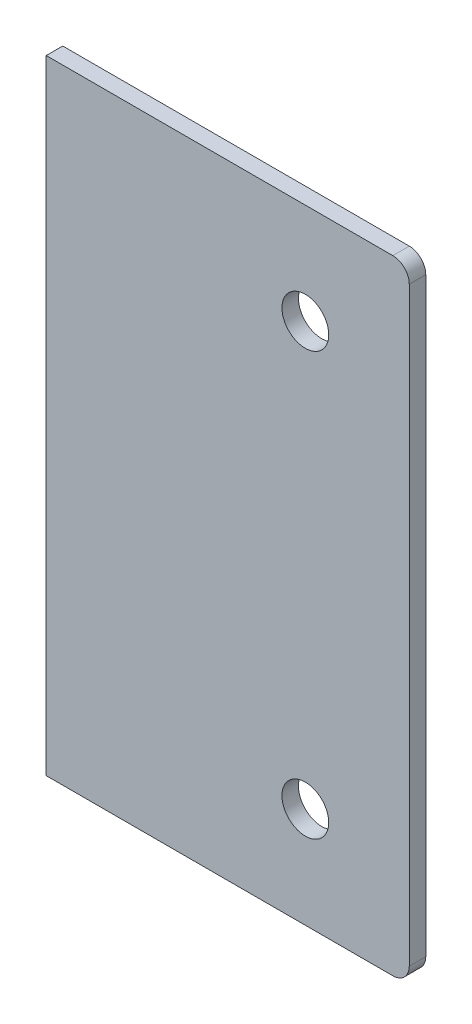
ISO-10303-21;
HEADER;
FILE_DESCRIPTION(('STEP AP214'),'2;1');
FILE_NAME('part.step','',(''),(''),'','','');
FILE_SCHEMA(('AUTOMOTIVE_DESIGN { 1 0 10303 214 1 1 1 1 }'));
ENDSEC;
DATA;
#1=APPLICATION_CONTEXT('core data for automotive mechanical design processes');
#2=APPLICATION_PROTOCOL_DEFINITION('international standard','automotive_design',2000,#1);
#3=PRODUCT_CONTEXT('',#1,'mechanical');
#4=PRODUCT('Part','Part','',(#3));
#5=PRODUCT_RELATED_PRODUCT_CATEGORY('part','',(#4));
#6=PRODUCT_DEFINITION_FORMATION('','',#4);
#7=PRODUCT_DEFINITION_CONTEXT('part definition',#1,'design');
#8=PRODUCT_DEFINITION('design','',#6,#7);
#9=PRODUCT_DEFINITION_SHAPE('','',#8);
#10=(LENGTH_UNIT() NAMED_UNIT(*) SI_UNIT(.MILLI.,.METRE.));
#11=(NAMED_UNIT(*) PLANE_ANGLE_UNIT() SI_UNIT($,.RADIAN.));
#12=(NAMED_UNIT(*) SI_UNIT($,.STERADIAN.) SOLID_ANGLE_UNIT());
#13=UNCERTAINTY_MEASURE_WITH_UNIT(LENGTH_MEASURE(1.E-05),#10,'distance_accuracy_value','');
#14=(GEOMETRIC_REPRESENTATION_CONTEXT(3) GLOBAL_UNCERTAINTY_ASSIGNED_CONTEXT((#13)) GLOBAL_UNIT_ASSIGNED_CONTEXT((#10,
#11,#12)) REPRESENTATION_CONTEXT('',''));
#15=CARTESIAN_POINT('',(0.,0.,0.));
#16=DIRECTION('',(0.,0.,1.));
#17=DIRECTION('',(1.,0.,0.));
#18=AXIS2_PLACEMENT_3D('',#15,#16,#17);
#19=CARTESIAN_POINT('',(9.38591339317018,73.2740420144,-1.5875));
#20=DIRECTION('',(1.,0.,0.));
#21=DIRECTION('',(0.,1.,0.));
#22=AXIS2_PLACEMENT_3D('',#19,#20,#21);
#23=PLANE('',#22);
#24=DIRECTION('',(0.,1.,0.));
#25=VECTOR('',#24,1.);
#26=CARTESIAN_POINT('',(9.38591339317018,73.2740420144,0.));
#27=LINE('',#26,#25);
#28=CARTESIAN_POINT('',(9.38591339317019,14.8615420144,0.));
#29=VERTEX_POINT('',#28);
#30=CARTESIAN_POINT('',(9.38591339317018,71.6865420143999,0.));
#31=VERTEX_POINT('',#30);
#32=EDGE_CURVE('E112',#29,#31,#27,.T.);
#33=ORIENTED_EDGE('',*,*,#32,.F.);
#34=DIRECTION('',(0.,0.,1.));
#35=VECTOR('',#34,1.);
#36=CARTESIAN_POINT('',(9.38591339317019,14.8615420144,-1.5875));
#37=LINE('',#36,#35);
#38=CARTESIAN_POINT('',(9.38591339317019,14.8615420144,-1.5875));
#39=VERTEX_POINT('',#38);
#40=EDGE_CURVE('E133',#29,#39,#37,.F.);
#41=ORIENTED_EDGE('',*,*,#40,.T.);
#42=DIRECTION('',(0.,1.,0.));
#43=VECTOR('',#42,1.);
#44=CARTESIAN_POINT('',(9.38591339317018,73.2740420144,-1.5875));
#45=LINE('',#44,#43);
#46=CARTESIAN_POINT('',(9.38591339317018,71.6865420143999,-1.5875));
#47=VERTEX_POINT('',#46);
#48=EDGE_CURVE('E95',#39,#47,#45,.T.);
#49=ORIENTED_EDGE('',*,*,#48,.T.);
#50=DIRECTION('',(0.,0.,1.));
#51=VECTOR('',#50,1.);
#52=CARTESIAN_POINT('',(9.38591339317018,71.6865420143999,-1.5875));
#53=LINE('',#52,#51);
#54=EDGE_CURVE('E130',#47,#31,#53,.T.);
#55=ORIENTED_EDGE('',*,*,#54,.T.);
#56=EDGE_LOOP('',(#33,#41,#49,#55));
#57=FACE_BOUND('',#56,.T.);
#58=ADVANCED_FACE('F37',(#57),#23,.T.);
#59=CARTESIAN_POINT('',(9.38591339317019,13.2740420144,-1.5875));
#60=DIRECTION('',(0.,-1.,0.));
#61=DIRECTION('',(1.,0.,0.));
#62=AXIS2_PLACEMENT_3D('',#59,#60,#61);
#63=PLANE('',#62);
#64=DIRECTION('',(1.,0.,0.));
#65=VECTOR('',#64,1.);
#66=CARTESIAN_POINT('',(9.38591339317019,13.2740420144,-1.5875));
#67=LINE('',#66,#65);
#68=CARTESIAN_POINT('',(-25.5390866068298,13.2740420144,-1.5875));
#69=VERTEX_POINT('',#68);
#70=CARTESIAN_POINT('',(7.79841339317019,13.2740420144,-1.5875));
#71=VERTEX_POINT('',#70);
#72=EDGE_CURVE('E104',#69,#71,#67,.T.);
#73=ORIENTED_EDGE('',*,*,#72,.T.);
#74=DIRECTION('',(0.,0.,1.));
#75=VECTOR('',#74,1.);
#76=CARTESIAN_POINT('',(7.79841339317019,13.2740420144,-1.5875));
#77=LINE('',#76,#75);
#78=CARTESIAN_POINT('',(7.79841339317019,13.2740420144,0.));
#79=VERTEX_POINT('',#78);
#80=EDGE_CURVE('E122',#71,#79,#77,.T.);
#81=ORIENTED_EDGE('',*,*,#80,.T.);
#82=DIRECTION('',(1.,0.,0.));
#83=VECTOR('',#82,1.);
#84=CARTESIAN_POINT('',(9.38591339317019,13.2740420144,0.));
#85=LINE('',#84,#83);
#86=CARTESIAN_POINT('',(-25.5390866068298,13.2740420144,0.));
#87=VERTEX_POINT('',#86);
#88=EDGE_CURVE('E119',#87,#79,#85,.T.);
#89=ORIENTED_EDGE('',*,*,#88,.F.);
#90=DIRECTION('',(0.,0.,1.));
#91=VECTOR('',#90,1.);
#92=CARTESIAN_POINT('',(-25.5390866068298,13.2740420144,-1.5875));
#93=LINE('',#92,#91);
#94=EDGE_CURVE('E103',#69,#87,#93,.T.);
#95=ORIENTED_EDGE('',*,*,#94,.F.);
#96=EDGE_LOOP('',(#73,#81,#89,#95));
#97=FACE_BOUND('',#96,.T.);
#98=ADVANCED_FACE('F140',(#97),#63,.T.);
#99=CARTESIAN_POINT('',(-25.5390866068298,73.2740420144,-1.5875));
#100=DIRECTION('',(-1.,0.,0.));
#101=DIRECTION('',(0.,-1.,0.));
#102=AXIS2_PLACEMENT_3D('',#99,#100,#101);
#103=PLANE('',#102);
#104=DIRECTION('',(0.,-1.,0.));
#105=VECTOR('',#104,1.);
#106=CARTESIAN_POINT('',(-25.5390866068298,73.2740420144,0.));
#107=LINE('',#106,#105);
#108=CARTESIAN_POINT('',(-25.5390866068298,73.2740420144,0.));
#109=VERTEX_POINT('',#108);
#110=EDGE_CURVE('E102',#109,#87,#107,.T.);
#111=ORIENTED_EDGE('',*,*,#110,.F.);
#112=DIRECTION('',(0.,0.,1.));
#113=VECTOR('',#112,1.);
#114=CARTESIAN_POINT('',(-25.5390866068298,73.2740420144,-1.5875));
#115=LINE('',#114,#113);
#116=CARTESIAN_POINT('',(-25.5390866068298,73.2740420144,-1.5875));
#117=VERTEX_POINT('',#116);
#118=EDGE_CURVE('E91',#117,#109,#115,.T.);
#119=ORIENTED_EDGE('',*,*,#118,.F.);
#120=DIRECTION('',(0.,-1.,0.));
#121=VECTOR('',#120,1.);
#122=CARTESIAN_POINT('',(-25.5390866068298,73.2740420144,-1.5875));
#123=LINE('',#122,#121);
#124=EDGE_CURVE('E94',#117,#69,#123,.T.);
#125=ORIENTED_EDGE('',*,*,#124,.T.);
#126=ORIENTED_EDGE('',*,*,#94,.T.);
#127=EDGE_LOOP('',(#111,#119,#125,#126));
#128=FACE_BOUND('',#127,.T.);
#129=ADVANCED_FACE('F99',(#128),#103,.T.);
#130=CARTESIAN_POINT('',(9.38591339317018,73.2740420144,-1.5875));
#131=DIRECTION('',(0.,1.,0.));
#132=DIRECTION('',(0.,0.,1.));
#133=AXIS2_PLACEMENT_3D('',#130,#131,#132);
#134=PLANE('',#133);
#135=DIRECTION('',(-1.,0.,0.));
#136=VECTOR('',#135,1.);
#137=CARTESIAN_POINT('',(9.38591339317018,73.2740420144,0.));
#138=LINE('',#137,#136);
#139=CARTESIAN_POINT('',(7.79841339317018,73.2740420144,0.));
#140=VERTEX_POINT('',#139);
#141=EDGE_CURVE('E115',#140,#109,#138,.T.);
#142=ORIENTED_EDGE('',*,*,#141,.F.);
#143=DIRECTION('',(0.,0.,1.));
#144=VECTOR('',#143,1.);
#145=CARTESIAN_POINT('',(7.79841339317018,73.2740420144,-1.5875));
#146=LINE('',#145,#144);
#147=CARTESIAN_POINT('',(7.79841339317018,73.2740420144,-1.5875));
#148=VERTEX_POINT('',#147);
#149=EDGE_CURVE('E11',#140,#148,#146,.F.);
#150=ORIENTED_EDGE('',*,*,#149,.T.);
#151=DIRECTION('',(-1.,0.,0.));
#152=VECTOR('',#151,1.);
#153=CARTESIAN_POINT('',(9.38591339317018,73.2740420144,-1.5875));
#154=LINE('',#153,#152);
#155=EDGE_CURVE('E88',#148,#117,#154,.T.);
#156=ORIENTED_EDGE('',*,*,#155,.T.);
#157=ORIENTED_EDGE('',*,*,#118,.T.);
#158=EDGE_LOOP('',(#142,#150,#156,#157));
#159=FACE_BOUND('',#158,.T.);
#160=ADVANCED_FACE('F90',(#159),#134,.T.);
#161=CARTESIAN_POINT('',(0.,0.,-1.5875));
#162=DIRECTION('',(0.,0.,-1.));
#163=DIRECTION('',(-1.,0.,0.));
#164=AXIS2_PLACEMENT_3D('',#161,#162,#163);
#165=PLANE('',#164);
#166=CARTESIAN_POINT('',(-0.614086606829815,63.5940420144,-1.5875));
#167=DIRECTION('',(0.,0.,-1.));
#168=DIRECTION('',(-1.,0.,0.));
#169=AXIS2_PLACEMENT_3D('',#166,#167,#168);
#170=CIRCLE('',#169,2.24999999999999);
#171=CARTESIAN_POINT('',(-2.8640866068298,63.5940420144,-1.5875));
#172=VERTEX_POINT('',#171);
#173=EDGE_CURVE('E185',#172,#172,#170,.T.);
#174=ORIENTED_EDGE('',*,*,#173,.F.);
#175=EDGE_LOOP('',(#174));
#176=FACE_BOUND('',#175,.T.);
#177=CARTESIAN_POINT('',(-0.614086606829821,22.9540420144,-1.5875));
#178=DIRECTION('',(0.,0.,-1.));
#179=DIRECTION('',(-1.,0.,0.));
#180=AXIS2_PLACEMENT_3D('',#177,#178,#179);
#181=CIRCLE('',#180,2.24999999999999);
#182=CARTESIAN_POINT('',(-2.86408660682981,22.9540420144,-1.5875));
#183=VERTEX_POINT('',#182);
#184=EDGE_CURVE('E187',#183,#183,#181,.T.);
#185=ORIENTED_EDGE('',*,*,#184,.F.);
#186=EDGE_LOOP('',(#185));
#187=FACE_BOUND('',#186,.T.);
#188=ORIENTED_EDGE('',*,*,#48,.F.);
#189=CARTESIAN_POINT('',(7.79841339317019,14.8615420144,-1.5875));
#190=DIRECTION('',(0.,0.,-1.));
#191=DIRECTION('',(-1.,0.,0.));
#192=AXIS2_PLACEMENT_3D('',#189,#190,#191);
#193=CIRCLE('',#192,1.5875);
#194=EDGE_CURVE('E45',#39,#71,#193,.T.);
#195=ORIENTED_EDGE('',*,*,#194,.T.);
#196=ORIENTED_EDGE('',*,*,#72,.F.);
#197=ORIENTED_EDGE('',*,*,#124,.F.);
#198=ORIENTED_EDGE('',*,*,#155,.F.);
#199=CARTESIAN_POINT('',(7.79841339317018,71.6865420143999,-1.5875));
#200=DIRECTION('',(0.,0.,-1.));
#201=DIRECTION('',(-1.,0.,0.));
#202=AXIS2_PLACEMENT_3D('',#199,#200,#201);
#203=CIRCLE('',#202,1.5875);
#204=EDGE_CURVE('E57',#148,#47,#203,.T.);
#205=ORIENTED_EDGE('',*,*,#204,.T.);
#206=EDGE_LOOP('',(#188,#195,#196,#197,#198,#205));
#207=FACE_BOUND('',#206,.T.);
#208=ADVANCED_FACE('F106',(#176,#187,#207),#165,.T.);
#209=CARTESIAN_POINT('',(0.,0.,0.));
#210=DIRECTION('',(0.,0.,-1.));
#211=DIRECTION('',(-1.,0.,0.));
#212=AXIS2_PLACEMENT_3D('',#209,#210,#211);
#213=PLANE('',#212);
#214=CARTESIAN_POINT('',(-0.614086606829815,63.5940420144,0.));
#215=DIRECTION('',(0.,0.,-1.));
#216=DIRECTION('',(-1.,0.,0.));
#217=AXIS2_PLACEMENT_3D('',#214,#215,#216);
#218=CIRCLE('',#217,2.25);
#219=CARTESIAN_POINT('',(-2.86408660682982,63.5940420144,0.));
#220=VERTEX_POINT('',#219);
#221=EDGE_CURVE('E182',#220,#220,#218,.T.);
#222=ORIENTED_EDGE('',*,*,#221,.T.);
#223=EDGE_LOOP('',(#222));
#224=FACE_BOUND('',#223,.T.);
#225=CARTESIAN_POINT('',(-0.614086606829821,22.9540420144,0.));
#226=DIRECTION('',(0.,0.,-1.));
#227=DIRECTION('',(-1.,0.,0.));
#228=AXIS2_PLACEMENT_3D('',#225,#226,#227);
#229=CIRCLE('',#228,2.25);
#230=CARTESIAN_POINT('',(-2.86408660682982,22.9540420144,0.));
#231=VERTEX_POINT('',#230);
#232=EDGE_CURVE('E116',#231,#231,#229,.T.);
#233=ORIENTED_EDGE('',*,*,#232,.T.);
#234=EDGE_LOOP('',(#233));
#235=FACE_BOUND('',#234,.T.);
#236=ORIENTED_EDGE('',*,*,#88,.T.);
#237=CARTESIAN_POINT('',(7.79841339317019,14.8615420144,0.));
#238=DIRECTION('',(0.,0.,-1.));
#239=DIRECTION('',(-1.,0.,0.));
#240=AXIS2_PLACEMENT_3D('',#237,#238,#239);
#241=CIRCLE('',#240,1.5875);
#242=EDGE_CURVE('E128',#79,#29,#241,.F.);
#243=ORIENTED_EDGE('',*,*,#242,.T.);
#244=ORIENTED_EDGE('',*,*,#32,.T.);
#245=CARTESIAN_POINT('',(7.79841339317018,71.6865420143999,0.));
#246=DIRECTION('',(0.,0.,-1.));
#247=DIRECTION('',(-1.,0.,0.));
#248=AXIS2_PLACEMENT_3D('',#245,#246,#247);
#249=CIRCLE('',#248,1.5875);
#250=EDGE_CURVE('E126',#31,#140,#249,.F.);
#251=ORIENTED_EDGE('',*,*,#250,.T.);
#252=ORIENTED_EDGE('',*,*,#141,.T.);
#253=ORIENTED_EDGE('',*,*,#110,.T.);
#254=EDGE_LOOP('',(#236,#243,#244,#251,#252,#253));
#255=FACE_BOUND('',#254,.T.);
#256=ADVANCED_FACE('F145',(#224,#235,#255),#213,.F.);
#257=CARTESIAN_POINT('',(-0.614086606829821,22.9540420144,-1.5875));
#258=DIRECTION('',(0.,0.,-1.));
#259=DIRECTION('',(-1.,0.,0.));
#260=AXIS2_PLACEMENT_3D('',#257,#258,#259);
#261=CYLINDRICAL_SURFACE('',#260,2.24999999999999);
#262=ORIENTED_EDGE('',*,*,#232,.F.);
#263=EDGE_LOOP('',(#262));
#264=FACE_BOUND('',#263,.T.);
#265=ORIENTED_EDGE('',*,*,#184,.T.);
#266=EDGE_LOOP('',(#265));
#267=FACE_BOUND('',#266,.T.);
#268=ADVANCED_FACE('F167',(#264,#267),#261,.F.);
#269=CARTESIAN_POINT('',(-0.614086606829815,63.5940420144,-1.5875));
#270=DIRECTION('',(0.,0.,-1.));
#271=DIRECTION('',(-1.,0.,0.));
#272=AXIS2_PLACEMENT_3D('',#269,#270,#271);
#273=CYLINDRICAL_SURFACE('',#272,2.24999999999999);
#274=ORIENTED_EDGE('',*,*,#221,.F.);
#275=EDGE_LOOP('',(#274));
#276=FACE_BOUND('',#275,.T.);
#277=ORIENTED_EDGE('',*,*,#173,.T.);
#278=EDGE_LOOP('',(#277));
#279=FACE_BOUND('',#278,.T.);
#280=ADVANCED_FACE('F153',(#276,#279),#273,.F.);
#281=CARTESIAN_POINT('',(7.79841339317019,14.8615420144,-1.5875));
#282=DIRECTION('',(0.,0.,1.));
#283=DIRECTION('',(1.,0.,0.));
#284=AXIS2_PLACEMENT_3D('',#281,#282,#283);
#285=CYLINDRICAL_SURFACE('',#284,1.5875);
#286=ORIENTED_EDGE('',*,*,#194,.F.);
#287=ORIENTED_EDGE('',*,*,#40,.F.);
#288=ORIENTED_EDGE('',*,*,#242,.F.);
#289=ORIENTED_EDGE('',*,*,#80,.F.);
#290=EDGE_LOOP('',(#286,#287,#288,#289));
#291=FACE_BOUND('',#290,.T.);
#292=ADVANCED_FACE('F142',(#291),#285,.T.);
#293=CARTESIAN_POINT('',(7.79841339317018,71.6865420143999,-1.5875));
#294=DIRECTION('',(0.,0.,1.));
#295=DIRECTION('',(1.,0.,0.));
#296=AXIS2_PLACEMENT_3D('',#293,#294,#295);
#297=CYLINDRICAL_SURFACE('',#296,1.5875);
#298=ORIENTED_EDGE('',*,*,#204,.F.);
#299=ORIENTED_EDGE('',*,*,#149,.F.);
#300=ORIENTED_EDGE('',*,*,#250,.F.);
#301=ORIENTED_EDGE('',*,*,#54,.F.);
#302=EDGE_LOOP('',(#298,#299,#300,#301));
#303=FACE_BOUND('',#302,.T.);
#304=ADVANCED_FACE('F39',(#303),#297,.T.);
#305=CLOSED_SHELL('',(#58,#98,#129,#160,#208,#256,#268,#280,#292,#304));
#306=MANIFOLD_SOLID_BREP('B2',#305);
#307=ADVANCED_BREP_SHAPE_REPRESENTATION('',(#18,#306),#14);
#308=SHAPE_DEFINITION_REPRESENTATION(#9,#307);
ENDSEC;
END-ISO-10303-21;
